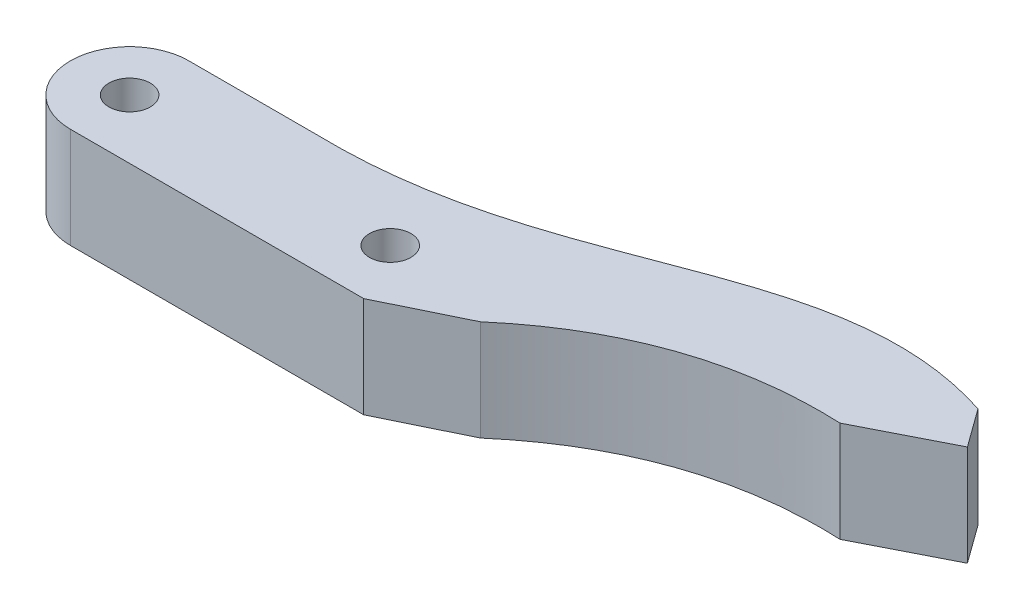
ISO-10303-21;
HEADER;
FILE_DESCRIPTION(('STEP AP214'),'2;1');
FILE_NAME('part.step','',(''),(''),'','','');
FILE_SCHEMA(('AUTOMOTIVE_DESIGN { 1 0 10303 214 1 1 1 1 }'));
ENDSEC;
DATA;
#1=APPLICATION_CONTEXT('core data for automotive mechanical design processes');
#2=APPLICATION_PROTOCOL_DEFINITION('international standard','automotive_design',2000,#1);
#3=PRODUCT_CONTEXT('',#1,'mechanical');
#4=PRODUCT('Part','Part','',(#3));
#5=PRODUCT_RELATED_PRODUCT_CATEGORY('part','',(#4));
#6=PRODUCT_DEFINITION_FORMATION('','',#4);
#7=PRODUCT_DEFINITION_CONTEXT('part definition',#1,'design');
#8=PRODUCT_DEFINITION('design','',#6,#7);
#9=PRODUCT_DEFINITION_SHAPE('','',#8);
#10=(LENGTH_UNIT() NAMED_UNIT(*) SI_UNIT(.MILLI.,.METRE.));
#11=(NAMED_UNIT(*) PLANE_ANGLE_UNIT() SI_UNIT($,.RADIAN.));
#12=(NAMED_UNIT(*) SI_UNIT($,.STERADIAN.) SOLID_ANGLE_UNIT());
#13=UNCERTAINTY_MEASURE_WITH_UNIT(LENGTH_MEASURE(1.E-05),#10,'distance_accuracy_value','');
#14=(GEOMETRIC_REPRESENTATION_CONTEXT(3) GLOBAL_UNCERTAINTY_ASSIGNED_CONTEXT((#13)) GLOBAL_UNIT_ASSIGNED_CONTEXT((#10,
#11,#12)) REPRESENTATION_CONTEXT('',''));
#15=CARTESIAN_POINT('',(0.,0.,0.));
#16=DIRECTION('',(0.,0.,1.));
#17=DIRECTION('',(1.,0.,0.));
#18=AXIS2_PLACEMENT_3D('',#15,#16,#17);
#19=CARTESIAN_POINT('',(0.,8.5,-5.));
#20=DIRECTION('',(0.,0.,-1.));
#21=DIRECTION('',(-1.,0.,0.));
#22=AXIS2_PLACEMENT_3D('',#19,#20,#21);
#23=PLANE('',#22);
#24=DIRECTION('',(1.,0.,0.));
#25=VECTOR('',#24,1.);
#26=CARTESIAN_POINT('',(0.,8.5,-5.));
#27=LINE('',#26,#25);
#28=CARTESIAN_POINT('',(0.,8.5,-5.));
#29=VERTEX_POINT('',#28);
#30=CARTESIAN_POINT('',(12.956629397549,8.5,-5.));
#31=VERTEX_POINT('',#30);
#32=EDGE_CURVE('E203',#29,#31,#27,.T.);
#33=ORIENTED_EDGE('',*,*,#32,.T.);
#34=DIRECTION('',(0.,1.,0.));
#35=VECTOR('',#34,1.);
#36=CARTESIAN_POINT('',(12.956629397549,0.,-5.));
#37=LINE('',#36,#35);
#38=CARTESIAN_POINT('',(12.956629397549,0.,-5.));
#39=VERTEX_POINT('',#38);
#40=EDGE_CURVE('E133',#39,#31,#37,.T.);
#41=ORIENTED_EDGE('',*,*,#40,.F.);
#42=DIRECTION('',(1.,0.,0.));
#43=VECTOR('',#42,1.);
#44=CARTESIAN_POINT('',(0.,0.,-5.));
#45=LINE('',#44,#43);
#46=CARTESIAN_POINT('',(0.,0.,-5.));
#47=VERTEX_POINT('',#46);
#48=EDGE_CURVE('E122',#47,#39,#45,.T.);
#49=ORIENTED_EDGE('',*,*,#48,.F.);
#50=DIRECTION('',(0.,-1.,0.));
#51=VECTOR('',#50,1.);
#52=CARTESIAN_POINT('',(0.,8.5,-5.));
#53=LINE('',#52,#51);
#54=EDGE_CURVE('E49',#29,#47,#53,.T.);
#55=ORIENTED_EDGE('',*,*,#54,.F.);
#56=EDGE_LOOP('',(#33,#41,#49,#55));
#57=FACE_BOUND('',#56,.T.);
#58=ADVANCED_FACE('F40',(#57),#23,.T.);
#59=CARTESIAN_POINT('',(0.,8.5,0.));
#60=DIRECTION('',(0.,-1.,0.));
#61=DIRECTION('',(0.,0.,-1.));
#62=AXIS2_PLACEMENT_3D('',#59,#60,#61);
#63=CYLINDRICAL_SURFACE('',#62,5.);
#64=CARTESIAN_POINT('',(0.,0.,0.));
#65=DIRECTION('',(0.,1.,0.));
#66=DIRECTION('',(0.,0.,1.));
#67=AXIS2_PLACEMENT_3D('',#64,#65,#66);
#68=CIRCLE('',#67,5.);
#69=CARTESIAN_POINT('',(0.,0.,5.));
#70=VERTEX_POINT('',#69);
#71=EDGE_CURVE('E210',#47,#70,#68,.T.);
#72=ORIENTED_EDGE('',*,*,#71,.T.);
#73=DIRECTION('',(0.,-1.,0.));
#74=VECTOR('',#73,1.);
#75=CARTESIAN_POINT('',(0.,8.5,5.));
#76=LINE('',#75,#74);
#77=CARTESIAN_POINT('',(0.,8.5,5.));
#78=VERTEX_POINT('',#77);
#79=EDGE_CURVE('E11',#78,#70,#76,.T.);
#80=ORIENTED_EDGE('',*,*,#79,.F.);
#81=CARTESIAN_POINT('',(0.,8.5,0.));
#82=DIRECTION('',(0.,1.,0.));
#83=DIRECTION('',(0.,0.,1.));
#84=AXIS2_PLACEMENT_3D('',#81,#82,#83);
#85=CIRCLE('',#84,5.);
#86=EDGE_CURVE('E199',#29,#78,#85,.T.);
#87=ORIENTED_EDGE('',*,*,#86,.F.);
#88=ORIENTED_EDGE('',*,*,#54,.T.);
#89=EDGE_LOOP('',(#72,#80,#87,#88));
#90=FACE_BOUND('',#89,.T.);
#91=ADVANCED_FACE('F217',(#90),#63,.T.);
#92=CARTESIAN_POINT('',(0.,8.5,5.));
#93=DIRECTION('',(0.,0.,-1.));
#94=DIRECTION('',(-1.,0.,0.));
#95=AXIS2_PLACEMENT_3D('',#92,#93,#94);
#96=PLANE('',#95);
#97=DIRECTION('',(1.,0.,0.));
#98=VECTOR('',#97,1.);
#99=CARTESIAN_POINT('',(0.,0.,5.));
#100=LINE('',#99,#98);
#101=CARTESIAN_POINT('',(24.7650147506925,0.,5.));
#102=VERTEX_POINT('',#101);
#103=EDGE_CURVE('E68',#70,#102,#100,.T.);
#104=ORIENTED_EDGE('',*,*,#103,.T.);
#105=DIRECTION('',(0.,1.,0.));
#106=VECTOR('',#105,1.);
#107=CARTESIAN_POINT('',(24.7650147506925,0.,5.));
#108=LINE('',#107,#106);
#109=CARTESIAN_POINT('',(24.7650147506925,8.5,5.));
#110=VERTEX_POINT('',#109);
#111=EDGE_CURVE('E185',#102,#110,#108,.T.);
#112=ORIENTED_EDGE('',*,*,#111,.T.);
#113=DIRECTION('',(1.,0.,0.));
#114=VECTOR('',#113,1.);
#115=CARTESIAN_POINT('',(0.,8.5,5.));
#116=LINE('',#115,#114);
#117=EDGE_CURVE('E99',#78,#110,#116,.T.);
#118=ORIENTED_EDGE('',*,*,#117,.F.);
#119=ORIENTED_EDGE('',*,*,#79,.T.);
#120=EDGE_LOOP('',(#104,#112,#118,#119));
#121=FACE_BOUND('',#120,.T.);
#122=ADVANCED_FACE('F228',(#121),#96,.F.);
#123=CARTESIAN_POINT('',(0.,8.5,0.));
#124=DIRECTION('',(0.,-1.,0.));
#125=DIRECTION('',(0.,0.,-1.));
#126=AXIS2_PLACEMENT_3D('',#123,#124,#125);
#127=CYLINDRICAL_SURFACE('',#126,1.75);
#128=CARTESIAN_POINT('',(0.,8.5,0.));
#129=DIRECTION('',(0.,1.,0.));
#130=DIRECTION('',(0.,0.,1.));
#131=AXIS2_PLACEMENT_3D('',#128,#129,#130);
#132=CIRCLE('',#131,1.75);
#133=CARTESIAN_POINT('',(0.,8.5,1.75));
#134=VERTEX_POINT('',#133);
#135=EDGE_CURVE('E196',#134,#134,#132,.T.);
#136=ORIENTED_EDGE('',*,*,#135,.T.);
#137=EDGE_LOOP('',(#136));
#138=FACE_BOUND('',#137,.T.);
#139=CARTESIAN_POINT('',(0.,0.,0.));
#140=DIRECTION('',(0.,1.,0.));
#141=DIRECTION('',(0.,0.,1.));
#142=AXIS2_PLACEMENT_3D('',#139,#140,#141);
#143=CIRCLE('',#142,1.75);
#144=CARTESIAN_POINT('',(0.,0.,1.75));
#145=VERTEX_POINT('',#144);
#146=EDGE_CURVE('E190',#145,#145,#143,.T.);
#147=ORIENTED_EDGE('',*,*,#146,.F.);
#148=EDGE_LOOP('',(#147));
#149=FACE_BOUND('',#148,.T.);
#150=ADVANCED_FACE('F42',(#138,#149),#127,.F.);
#151=CARTESIAN_POINT('',(22.,8.5,0.));
#152=DIRECTION('',(0.,-1.,0.));
#153=DIRECTION('',(0.,0.,-1.));
#154=AXIS2_PLACEMENT_3D('',#151,#152,#153);
#155=CYLINDRICAL_SURFACE('',#154,1.75);
#156=CARTESIAN_POINT('',(22.,8.5,0.));
#157=DIRECTION('',(0.,1.,0.));
#158=DIRECTION('',(0.,0.,1.));
#159=AXIS2_PLACEMENT_3D('',#156,#157,#158);
#160=CIRCLE('',#159,1.75);
#161=CARTESIAN_POINT('',(22.,8.5,1.75));
#162=VERTEX_POINT('',#161);
#163=EDGE_CURVE('E205',#162,#162,#160,.T.);
#164=ORIENTED_EDGE('',*,*,#163,.T.);
#165=EDGE_LOOP('',(#164));
#166=FACE_BOUND('',#165,.T.);
#167=CARTESIAN_POINT('',(22.,0.,0.));
#168=DIRECTION('',(0.,1.,0.));
#169=DIRECTION('',(0.,0.,1.));
#170=AXIS2_PLACEMENT_3D('',#167,#168,#169);
#171=CIRCLE('',#170,1.75);
#172=CARTESIAN_POINT('',(22.,0.,1.75));
#173=VERTEX_POINT('',#172);
#174=EDGE_CURVE('E200',#173,#173,#171,.T.);
#175=ORIENTED_EDGE('',*,*,#174,.F.);
#176=EDGE_LOOP('',(#175));
#177=FACE_BOUND('',#176,.T.);
#178=ADVANCED_FACE('F235',(#166,#177),#155,.F.);
#179=CARTESIAN_POINT('',(0.,8.5,0.));
#180=DIRECTION('',(0.,1.,0.));
#181=DIRECTION('',(0.,0.,1.));
#182=AXIS2_PLACEMENT_3D('',#179,#180,#181);
#183=PLANE('',#182);
#184=ORIENTED_EDGE('',*,*,#135,.F.);
#185=EDGE_LOOP('',(#184));
#186=FACE_BOUND('',#185,.T.);
#187=ORIENTED_EDGE('',*,*,#86,.T.);
#188=ORIENTED_EDGE('',*,*,#117,.T.);
#189=DIRECTION('',(0.898794046299166,0.,-0.438371146789079));
#190=VECTOR('',#189,1.);
#191=CARTESIAN_POINT('',(6.72910150042657,8.5,13.7967026567016));
#192=LINE('',#191,#190);
#193=CARTESIAN_POINT('',(31.3814191635447,8.5,1.77296394872103));
#194=VERTEX_POINT('',#193);
#195=EDGE_CURVE('E148',#110,#194,#192,.T.);
#196=ORIENTED_EDGE('',*,*,#195,.T.);
#197=CARTESIAN_POINT('',(31.3814191635447,8.5,1.77296394872102));
#198=CARTESIAN_POINT('',(41.1292594506154,8.5,-6.58269945850607));
#199=CARTESIAN_POINT('',(53.9668629845184,8.5,-6.));
#200=B_SPLINE_CURVE_WITH_KNOTS('',2,(#197,#198,#199),.UNSPECIFIED.,.F.,.F.,(3,3),(0.,1.),.UNSPECIFIED.);
#201=CARTESIAN_POINT('',(53.9668629845184,8.5,-6.));
#202=VERTEX_POINT('',#201);
#203=EDGE_CURVE('E226',#194,#202,#200,.T.);
#204=ORIENTED_EDGE('',*,*,#203,.T.);
#205=DIRECTION('',(-0.891123109176892,0.,0.453761616149833));
#206=VECTOR('',#205,1.);
#207=CARTESIAN_POINT('',(8.6856109600826,8.5,17.057301385523));
#208=LINE('',#207,#206);
#209=CARTESIAN_POINT('',(61.0958478579336,8.5,-9.63009292919867));
#210=VERTEX_POINT('',#209);
#211=EDGE_CURVE('E179',#210,#202,#208,.T.);
#212=ORIENTED_EDGE('',*,*,#211,.F.);
#213=DIRECTION('',(0.586461964483392,0.,0.809976767700334));
#214=VECTOR('',#213,1.);
#215=CARTESIAN_POINT('',(44.6571785867895,8.5,-32.3339356468847));
#216=LINE('',#215,#214);
#217=CARTESIAN_POINT('',(58.75,8.5,-12.87));
#218=VERTEX_POINT('',#217);
#219=EDGE_CURVE('E177',#218,#210,#216,.T.);
#220=ORIENTED_EDGE('',*,*,#219,.F.);
#221=CARTESIAN_POINT('',(11.,8.5,-5.));
#222=CARTESIAN_POINT('',(31.5833074940391,8.5,-4.55379435802458));
#223=CARTESIAN_POINT('',(41.794512185296,8.5,-18.3240256569883));
#224=CARTESIAN_POINT('',(58.75,8.5,-12.87));
#225=B_SPLINE_CURVE_WITH_KNOTS('',3,(#221,#222,#223,#224),.UNSPECIFIED.,.F.,.F.,(4,4),(0.,1.),.UNSPECIFIED.);
#226=EDGE_CURVE('E130',#31,#218,#225,.T.);
#227=ORIENTED_EDGE('',*,*,#226,.F.);
#228=ORIENTED_EDGE('',*,*,#32,.F.);
#229=EDGE_LOOP('',(#187,#188,#196,#204,#212,#220,#227,#228));
#230=FACE_BOUND('',#229,.T.);
#231=ORIENTED_EDGE('',*,*,#163,.F.);
#232=EDGE_LOOP('',(#231));
#233=FACE_BOUND('',#232,.T.);
#234=ADVANCED_FACE('F220',(#186,#230,#233),#183,.T.);
#235=CARTESIAN_POINT('',(0.,0.,0.));
#236=DIRECTION('',(0.,1.,0.));
#237=DIRECTION('',(0.,0.,1.));
#238=AXIS2_PLACEMENT_3D('',#235,#236,#237);
#239=PLANE('',#238);
#240=ORIENTED_EDGE('',*,*,#146,.T.);
#241=EDGE_LOOP('',(#240));
#242=FACE_BOUND('',#241,.T.);
#243=ORIENTED_EDGE('',*,*,#71,.F.);
#244=ORIENTED_EDGE('',*,*,#48,.T.);
#245=CARTESIAN_POINT('',(11.,0.,-5.));
#246=CARTESIAN_POINT('',(31.5833074940391,0.,-4.55379435802458));
#247=CARTESIAN_POINT('',(41.794512185296,0.,-18.3240256569883));
#248=CARTESIAN_POINT('',(58.75,0.,-12.87));
#249=B_SPLINE_CURVE_WITH_KNOTS('',3,(#245,#246,#247,#248),.UNSPECIFIED.,.F.,.F.,(4,4),(0.,1.),.UNSPECIFIED.);
#250=CARTESIAN_POINT('',(58.75,0.,-12.87));
#251=VERTEX_POINT('',#250);
#252=EDGE_CURVE('E115',#39,#251,#249,.T.);
#253=ORIENTED_EDGE('',*,*,#252,.T.);
#254=DIRECTION('',(0.586461964483392,0.,0.809976767700334));
#255=VECTOR('',#254,1.);
#256=CARTESIAN_POINT('',(44.6571785867895,0.,-32.3339356468847));
#257=LINE('',#256,#255);
#258=CARTESIAN_POINT('',(61.0958478579336,0.,-9.63009292919867));
#259=VERTEX_POINT('',#258);
#260=EDGE_CURVE('E120',#251,#259,#257,.T.);
#261=ORIENTED_EDGE('',*,*,#260,.T.);
#262=DIRECTION('',(-0.891123109176892,0.,0.453761616149833));
#263=VECTOR('',#262,1.);
#264=CARTESIAN_POINT('',(8.6856109600826,0.,17.057301385523));
#265=LINE('',#264,#263);
#266=CARTESIAN_POINT('',(53.9668629845184,0.,-6.));
#267=VERTEX_POINT('',#266);
#268=EDGE_CURVE('E139',#259,#267,#265,.T.);
#269=ORIENTED_EDGE('',*,*,#268,.T.);
#270=CARTESIAN_POINT('',(31.3814191635447,0.,1.77296394872102));
#271=CARTESIAN_POINT('',(41.1292594506154,0.,-6.58269945850607));
#272=CARTESIAN_POINT('',(53.9668629845184,0.,-6.));
#273=B_SPLINE_CURVE_WITH_KNOTS('',2,(#270,#271,#272),.UNSPECIFIED.,.F.,.F.,(3,3),(0.,1.),.UNSPECIFIED.);
#274=CARTESIAN_POINT('',(31.3814191635447,0.,1.77296394872103));
#275=VERTEX_POINT('',#274);
#276=EDGE_CURVE('E141',#275,#267,#273,.T.);
#277=ORIENTED_EDGE('',*,*,#276,.F.);
#278=DIRECTION('',(0.898794046299166,0.,-0.438371146789079));
#279=VECTOR('',#278,1.);
#280=CARTESIAN_POINT('',(6.72910150042657,0.,13.7967026567016));
#281=LINE('',#280,#279);
#282=EDGE_CURVE('E171',#102,#275,#281,.T.);
#283=ORIENTED_EDGE('',*,*,#282,.F.);
#284=ORIENTED_EDGE('',*,*,#103,.F.);
#285=EDGE_LOOP('',(#243,#244,#253,#261,#269,#277,#283,#284));
#286=FACE_BOUND('',#285,.T.);
#287=ORIENTED_EDGE('',*,*,#174,.T.);
#288=EDGE_LOOP('',(#287));
#289=FACE_BOUND('',#288,.T.);
#290=ADVANCED_FACE('F117',(#242,#286,#289),#239,.F.);
#291=CARTESIAN_POINT('',(6.72910150042657,0.,13.7967026567016));
#292=DIRECTION('',(0.438371146789079,0.,0.898794046299166));
#293=DIRECTION('',(0.898794046299166,0.,-0.438371146789079));
#294=AXIS2_PLACEMENT_3D('',#291,#292,#293);
#295=PLANE('',#294);
#296=ORIENTED_EDGE('',*,*,#195,.F.);
#297=ORIENTED_EDGE('',*,*,#111,.F.);
#298=ORIENTED_EDGE('',*,*,#282,.T.);
#299=DIRECTION('',(0.,1.,0.));
#300=VECTOR('',#299,1.);
#301=CARTESIAN_POINT('',(31.3814191635447,0.,1.77296394872103));
#302=LINE('',#301,#300);
#303=EDGE_CURVE('E106',#275,#194,#302,.T.);
#304=ORIENTED_EDGE('',*,*,#303,.T.);
#305=EDGE_LOOP('',(#296,#297,#298,#304));
#306=FACE_BOUND('',#305,.T.);
#307=ADVANCED_FACE('F156',(#306),#295,.T.);
#308=DIRECTION('',(0.,1.,0.));
#309=VECTOR('',#308,1.);
#310=SURFACE_OF_LINEAR_EXTRUSION('',#249,#309);
#311=ORIENTED_EDGE('',*,*,#226,.T.);
#312=DIRECTION('',(0.,1.,0.));
#313=VECTOR('',#312,1.);
#314=CARTESIAN_POINT('',(58.75,0.,-12.87));
#315=LINE('',#314,#313);
#316=EDGE_CURVE('E127',#251,#218,#315,.T.);
#317=ORIENTED_EDGE('',*,*,#316,.F.);
#318=ORIENTED_EDGE('',*,*,#252,.F.);
#319=ORIENTED_EDGE('',*,*,#40,.T.);
#320=EDGE_LOOP('',(#311,#317,#318,#319));
#321=FACE_BOUND('',#320,.T.);
#322=ADVANCED_FACE('F128',(#321),#310,.F.);
#323=CARTESIAN_POINT('',(44.6571785867895,0.,-32.3339356468847));
#324=DIRECTION('',(-0.809976767700334,0.,0.586461964483392));
#325=DIRECTION('',(0.586461964483392,0.,0.809976767700334));
#326=AXIS2_PLACEMENT_3D('',#323,#324,#325);
#327=PLANE('',#326);
#328=ORIENTED_EDGE('',*,*,#219,.T.);
#329=DIRECTION('',(0.,1.,0.));
#330=VECTOR('',#329,1.);
#331=CARTESIAN_POINT('',(61.0958478579336,0.,-9.63009292919867));
#332=LINE('',#331,#330);
#333=EDGE_CURVE('E134',#259,#210,#332,.T.);
#334=ORIENTED_EDGE('',*,*,#333,.F.);
#335=ORIENTED_EDGE('',*,*,#260,.F.);
#336=ORIENTED_EDGE('',*,*,#316,.T.);
#337=EDGE_LOOP('',(#328,#334,#335,#336));
#338=FACE_BOUND('',#337,.T.);
#339=ADVANCED_FACE('F136',(#338),#327,.F.);
#340=CARTESIAN_POINT('',(8.6856109600826,0.,17.057301385523));
#341=DIRECTION('',(-0.453761616149833,0.,-0.891123109176892));
#342=DIRECTION('',(-0.891123109176892,0.,0.453761616149833));
#343=AXIS2_PLACEMENT_3D('',#340,#341,#342);
#344=PLANE('',#343);
#345=ORIENTED_EDGE('',*,*,#211,.T.);
#346=DIRECTION('',(0.,1.,0.));
#347=VECTOR('',#346,1.);
#348=CARTESIAN_POINT('',(53.9668629845184,0.,-6.));
#349=LINE('',#348,#347);
#350=EDGE_CURVE('E193',#267,#202,#349,.T.);
#351=ORIENTED_EDGE('',*,*,#350,.F.);
#352=ORIENTED_EDGE('',*,*,#268,.F.);
#353=ORIENTED_EDGE('',*,*,#333,.T.);
#354=EDGE_LOOP('',(#345,#351,#352,#353));
#355=FACE_BOUND('',#354,.T.);
#356=ADVANCED_FACE('F159',(#355),#344,.F.);
#357=DIRECTION('',(0.,1.,0.));
#358=VECTOR('',#357,1.);
#359=SURFACE_OF_LINEAR_EXTRUSION('',#273,#358);
#360=ORIENTED_EDGE('',*,*,#203,.F.);
#361=ORIENTED_EDGE('',*,*,#303,.F.);
#362=ORIENTED_EDGE('',*,*,#276,.T.);
#363=ORIENTED_EDGE('',*,*,#350,.T.);
#364=EDGE_LOOP('',(#360,#361,#362,#363));
#365=FACE_BOUND('',#364,.T.);
#366=ADVANCED_FACE('F162',(#365),#359,.T.);
#367=CLOSED_SHELL('',(#58,#91,#122,#150,#178,#234,#290,#307,#322,#339,#356,#366));
#368=MANIFOLD_SOLID_BREP('B2',#367);
#369=ADVANCED_BREP_SHAPE_REPRESENTATION('',(#18,#368),#14);
#370=SHAPE_DEFINITION_REPRESENTATION(#9,#369);
ENDSEC;
END-ISO-10303-21;
